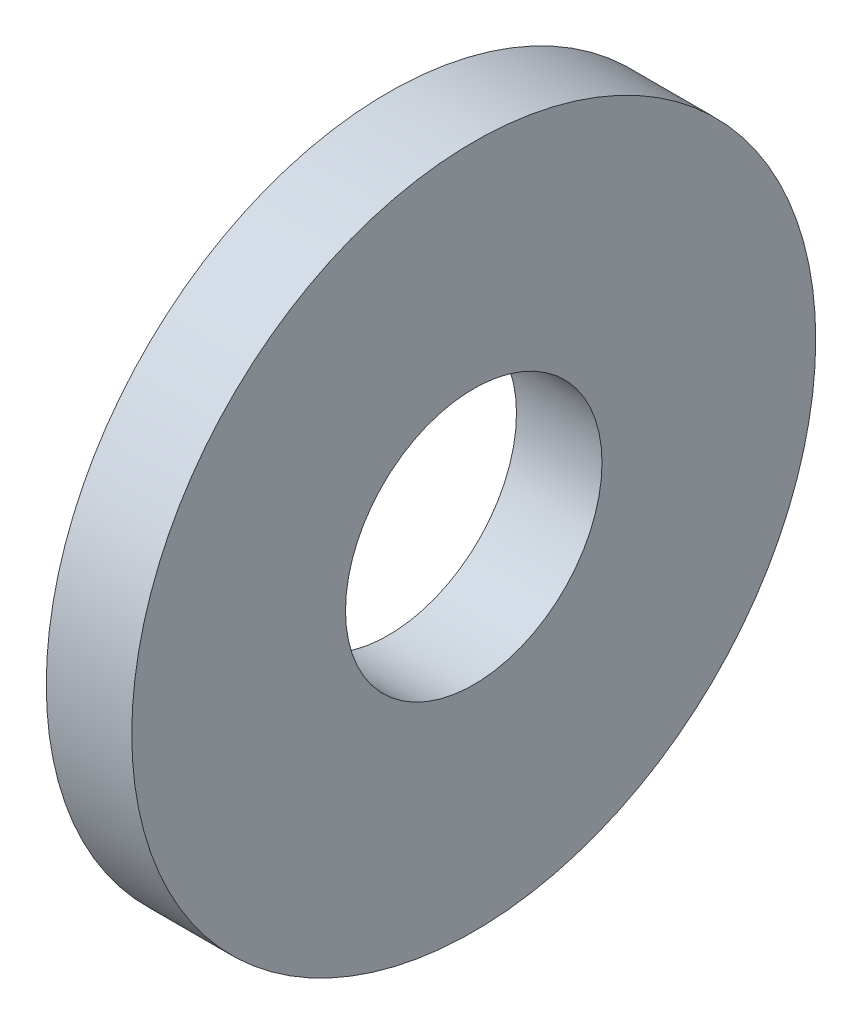
ISO-10303-21;
HEADER;
FILE_DESCRIPTION(('STEP AP214'),'2;1');
FILE_NAME('part.step','',(''),(''),'','','');
FILE_SCHEMA(('AUTOMOTIVE_DESIGN { 1 0 10303 214 1 1 1 1 }'));
ENDSEC;
DATA;
#1=APPLICATION_CONTEXT('core data for automotive mechanical design processes');
#2=APPLICATION_PROTOCOL_DEFINITION('international standard','automotive_design',2000,#1);
#3=PRODUCT_CONTEXT('',#1,'mechanical');
#4=PRODUCT('Part','Part','',(#3));
#5=PRODUCT_RELATED_PRODUCT_CATEGORY('part','',(#4));
#6=PRODUCT_DEFINITION_FORMATION('','',#4);
#7=PRODUCT_DEFINITION_CONTEXT('part definition',#1,'design');
#8=PRODUCT_DEFINITION('design','',#6,#7);
#9=PRODUCT_DEFINITION_SHAPE('','',#8);
#10=(LENGTH_UNIT() NAMED_UNIT(*) SI_UNIT(.MILLI.,.METRE.));
#11=(NAMED_UNIT(*) PLANE_ANGLE_UNIT() SI_UNIT($,.RADIAN.));
#12=(NAMED_UNIT(*) SI_UNIT($,.STERADIAN.) SOLID_ANGLE_UNIT());
#13=UNCERTAINTY_MEASURE_WITH_UNIT(LENGTH_MEASURE(1.E-05),#10,'distance_accuracy_value','');
#14=(GEOMETRIC_REPRESENTATION_CONTEXT(3) GLOBAL_UNCERTAINTY_ASSIGNED_CONTEXT((#13)) GLOBAL_UNIT_ASSIGNED_CONTEXT((#10,
#11,#12)) REPRESENTATION_CONTEXT('',''));
#15=CARTESIAN_POINT('',(0.,0.,0.));
#16=DIRECTION('',(0.,0.,1.));
#17=DIRECTION('',(1.,0.,0.));
#18=AXIS2_PLACEMENT_3D('',#15,#16,#17);
#19=CARTESIAN_POINT('',(1.,0.,0.));
#20=DIRECTION('',(1.,0.,0.));
#21=DIRECTION('',(0.,0.,-1.));
#22=AXIS2_PLACEMENT_3D('',#19,#20,#21);
#23=PLANE('',#22);
#24=CARTESIAN_POINT('',(1.,0.,0.));
#25=DIRECTION('',(1.,0.,0.));
#26=DIRECTION('',(0.,0.,-1.));
#27=AXIS2_PLACEMENT_3D('',#24,#25,#26);
#28=CIRCLE('',#27,4.);
#29=CARTESIAN_POINT('',(1.,0.,-4.));
#30=VERTEX_POINT('',#29);
#31=EDGE_CURVE('E10',#30,#30,#28,.T.);
#32=ORIENTED_EDGE('',*,*,#31,.T.);
#33=EDGE_LOOP('',(#32));
#34=FACE_BOUND('',#33,.T.);
#35=CARTESIAN_POINT('',(1.,0.,0.));
#36=DIRECTION('',(1.,0.,0.));
#37=DIRECTION('',(0.,0.,-1.));
#38=AXIS2_PLACEMENT_3D('',#35,#36,#37);
#39=CIRCLE('',#38,1.5);
#40=CARTESIAN_POINT('',(1.,0.,-1.5));
#41=VERTEX_POINT('',#40);
#42=EDGE_CURVE('E41',#41,#41,#39,.T.);
#43=ORIENTED_EDGE('',*,*,#42,.F.);
#44=EDGE_LOOP('',(#43));
#45=FACE_BOUND('',#44,.T.);
#46=ADVANCED_FACE('F30',(#34,#45),#23,.T.);
#47=CARTESIAN_POINT('',(0.,0.,0.));
#48=DIRECTION('',(1.,0.,0.));
#49=DIRECTION('',(0.,0.,-1.));
#50=AXIS2_PLACEMENT_3D('',#47,#48,#49);
#51=PLANE('',#50);
#52=CARTESIAN_POINT('',(0.,0.,0.));
#53=DIRECTION('',(1.,0.,0.));
#54=DIRECTION('',(0.,0.,-1.));
#55=AXIS2_PLACEMENT_3D('',#52,#53,#54);
#56=CIRCLE('',#55,4.);
#57=CARTESIAN_POINT('',(0.,0.,-4.));
#58=VERTEX_POINT('',#57);
#59=EDGE_CURVE('E34',#58,#58,#56,.T.);
#60=ORIENTED_EDGE('',*,*,#59,.F.);
#61=EDGE_LOOP('',(#60));
#62=FACE_BOUND('',#61,.T.);
#63=CARTESIAN_POINT('',(0.,0.,0.));
#64=DIRECTION('',(1.,0.,0.));
#65=DIRECTION('',(0.,0.,-1.));
#66=AXIS2_PLACEMENT_3D('',#63,#64,#65);
#67=CIRCLE('',#66,1.5);
#68=CARTESIAN_POINT('',(0.,0.,-1.5));
#69=VERTEX_POINT('',#68);
#70=EDGE_CURVE('E43',#69,#69,#67,.T.);
#71=ORIENTED_EDGE('',*,*,#70,.T.);
#72=EDGE_LOOP('',(#71));
#73=FACE_BOUND('',#72,.T.);
#74=ADVANCED_FACE('F53',(#62,#73),#51,.F.);
#75=CARTESIAN_POINT('',(1.,0.,0.));
#76=DIRECTION('',(-1.,0.,0.));
#77=DIRECTION('',(0.,0.,1.));
#78=AXIS2_PLACEMENT_3D('',#75,#76,#77);
#79=CYLINDRICAL_SURFACE('',#78,4.);
#80=ORIENTED_EDGE('',*,*,#31,.F.);
#81=EDGE_LOOP('',(#80));
#82=FACE_BOUND('',#81,.T.);
#83=ORIENTED_EDGE('',*,*,#59,.T.);
#84=EDGE_LOOP('',(#83));
#85=FACE_BOUND('',#84,.T.);
#86=ADVANCED_FACE('F32',(#82,#85),#79,.T.);
#87=CARTESIAN_POINT('',(1.,0.,0.));
#88=DIRECTION('',(-1.,0.,0.));
#89=DIRECTION('',(0.,0.,1.));
#90=AXIS2_PLACEMENT_3D('',#87,#88,#89);
#91=CYLINDRICAL_SURFACE('',#90,1.5);
#92=ORIENTED_EDGE('',*,*,#42,.T.);
#93=EDGE_LOOP('',(#92));
#94=FACE_BOUND('',#93,.T.);
#95=ORIENTED_EDGE('',*,*,#70,.F.);
#96=EDGE_LOOP('',(#95));
#97=FACE_BOUND('',#96,.T.);
#98=ADVANCED_FACE('F49',(#94,#97),#91,.F.);
#99=CLOSED_SHELL('',(#46,#74,#86,#98));
#100=MANIFOLD_SOLID_BREP('B2',#99);
#101=ADVANCED_BREP_SHAPE_REPRESENTATION('',(#18,#100),#14);
#102=SHAPE_DEFINITION_REPRESENTATION(#9,#101);
ENDSEC;
END-ISO-10303-21;
